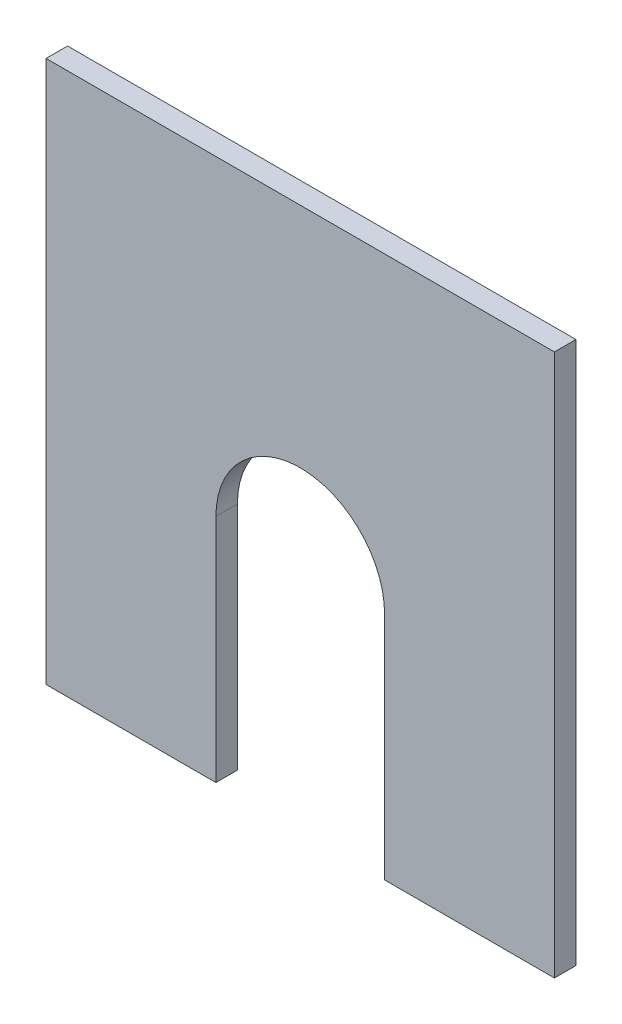
ISO-10303-21;
HEADER;
FILE_DESCRIPTION(('STEP AP214'),'2;1');
FILE_NAME('part.step','',(''),(''),'','','');
FILE_SCHEMA(('AUTOMOTIVE_DESIGN { 1 0 10303 214 1 1 1 1 }'));
ENDSEC;
DATA;
#1=APPLICATION_CONTEXT('core data for automotive mechanical design processes');
#2=APPLICATION_PROTOCOL_DEFINITION('international standard','automotive_design',2000,#1);
#3=PRODUCT_CONTEXT('',#1,'mechanical');
#4=PRODUCT('Part','Part','',(#3));
#5=PRODUCT_RELATED_PRODUCT_CATEGORY('part','',(#4));
#6=PRODUCT_DEFINITION_FORMATION('','',#4);
#7=PRODUCT_DEFINITION_CONTEXT('part definition',#1,'design');
#8=PRODUCT_DEFINITION('design','',#6,#7);
#9=PRODUCT_DEFINITION_SHAPE('','',#8);
#10=(LENGTH_UNIT() NAMED_UNIT(*) SI_UNIT(.MILLI.,.METRE.));
#11=(NAMED_UNIT(*) PLANE_ANGLE_UNIT() SI_UNIT($,.RADIAN.));
#12=(NAMED_UNIT(*) SI_UNIT($,.STERADIAN.) SOLID_ANGLE_UNIT());
#13=UNCERTAINTY_MEASURE_WITH_UNIT(LENGTH_MEASURE(1.E-05),#10,'distance_accuracy_value','');
#14=(GEOMETRIC_REPRESENTATION_CONTEXT(3) GLOBAL_UNCERTAINTY_ASSIGNED_CONTEXT((#13)) GLOBAL_UNIT_ASSIGNED_CONTEXT((#10,
#11,#12)) REPRESENTATION_CONTEXT('',''));
#15=CARTESIAN_POINT('',(0.,0.,0.));
#16=DIRECTION('',(0.,0.,1.));
#17=DIRECTION('',(1.,0.,0.));
#18=AXIS2_PLACEMENT_3D('',#15,#16,#17);
#19=CARTESIAN_POINT('',(-75.,-80.,6.35));
#20=DIRECTION('',(0.,1.,0.));
#21=DIRECTION('',(0.,0.,1.));
#22=AXIS2_PLACEMENT_3D('',#19,#20,#21);
#23=PLANE('',#22);
#24=DIRECTION('',(1.,0.,0.));
#25=VECTOR('',#24,1.);
#26=CARTESIAN_POINT('',(-75.,-80.,0.));
#27=LINE('',#26,#25);
#28=CARTESIAN_POINT('',(-75.,-80.,0.));
#29=VERTEX_POINT('',#28);
#30=CARTESIAN_POINT('',(-24.89,-80.,0.));
#31=VERTEX_POINT('',#30);
#32=EDGE_CURVE('E122',#29,#31,#27,.T.);
#33=ORIENTED_EDGE('',*,*,#32,.T.);
#34=DIRECTION('',(0.,0.,1.));
#35=VECTOR('',#34,1.);
#36=CARTESIAN_POINT('',(-24.89,-80.,-0.00100000000000013));
#37=LINE('',#36,#35);
#38=CARTESIAN_POINT('',(-24.89,-80.,6.35));
#39=VERTEX_POINT('',#38);
#40=EDGE_CURVE('E114',#31,#39,#37,.T.);
#41=ORIENTED_EDGE('',*,*,#40,.T.);
#42=DIRECTION('',(1.,0.,0.));
#43=VECTOR('',#42,1.);
#44=CARTESIAN_POINT('',(-75.,-80.,6.35));
#45=LINE('',#44,#43);
#46=CARTESIAN_POINT('',(-75.,-80.,6.35));
#47=VERTEX_POINT('',#46);
#48=EDGE_CURVE('E134',#47,#39,#45,.T.);
#49=ORIENTED_EDGE('',*,*,#48,.F.);
#50=DIRECTION('',(0.,0.,-1.));
#51=VECTOR('',#50,1.);
#52=CARTESIAN_POINT('',(-75.,-80.,6.35));
#53=LINE('',#52,#51);
#54=EDGE_CURVE('E133',#47,#29,#53,.T.);
#55=ORIENTED_EDGE('',*,*,#54,.T.);
#56=EDGE_LOOP('',(#33,#41,#49,#55));
#57=FACE_BOUND('',#56,.T.);
#58=ADVANCED_FACE('F33',(#57),#23,.F.);
#59=CARTESIAN_POINT('',(75.,80.,6.35));
#60=DIRECTION('',(-1.,0.,0.));
#61=DIRECTION('',(0.,0.,1.));
#62=AXIS2_PLACEMENT_3D('',#59,#60,#61);
#63=PLANE('',#62);
#64=DIRECTION('',(0.,1.,0.));
#65=VECTOR('',#64,1.);
#66=CARTESIAN_POINT('',(75.,80.,0.));
#67=LINE('',#66,#65);
#68=CARTESIAN_POINT('',(75.,-80.,0.));
#69=VERTEX_POINT('',#68);
#70=CARTESIAN_POINT('',(75.,80.,0.));
#71=VERTEX_POINT('',#70);
#72=EDGE_CURVE('E113',#69,#71,#67,.T.);
#73=ORIENTED_EDGE('',*,*,#72,.T.);
#74=DIRECTION('',(0.,0.,-1.));
#75=VECTOR('',#74,1.);
#76=CARTESIAN_POINT('',(75.,80.,6.35));
#77=LINE('',#76,#75);
#78=CARTESIAN_POINT('',(75.,80.,6.35));
#79=VERTEX_POINT('',#78);
#80=EDGE_CURVE('E11',#79,#71,#77,.T.);
#81=ORIENTED_EDGE('',*,*,#80,.F.);
#82=DIRECTION('',(0.,1.,0.));
#83=VECTOR('',#82,1.);
#84=CARTESIAN_POINT('',(75.,80.,6.35));
#85=LINE('',#84,#83);
#86=CARTESIAN_POINT('',(75.,-80.,6.35));
#87=VERTEX_POINT('',#86);
#88=EDGE_CURVE('E126',#87,#79,#85,.T.);
#89=ORIENTED_EDGE('',*,*,#88,.F.);
#90=DIRECTION('',(0.,0.,-1.));
#91=VECTOR('',#90,1.);
#92=CARTESIAN_POINT('',(75.,-80.,6.35));
#93=LINE('',#92,#91);
#94=EDGE_CURVE('E131',#87,#69,#93,.T.);
#95=ORIENTED_EDGE('',*,*,#94,.T.);
#96=EDGE_LOOP('',(#73,#81,#89,#95));
#97=FACE_BOUND('',#96,.T.);
#98=ADVANCED_FACE('F35',(#97),#63,.F.);
#99=CARTESIAN_POINT('',(-75.,80.,6.35));
#100=DIRECTION('',(0.,-1.,0.));
#101=DIRECTION('',(0.,0.,-1.));
#102=AXIS2_PLACEMENT_3D('',#99,#100,#101);
#103=PLANE('',#102);
#104=DIRECTION('',(-1.,0.,0.));
#105=VECTOR('',#104,1.);
#106=CARTESIAN_POINT('',(-75.,80.,0.));
#107=LINE('',#106,#105);
#108=CARTESIAN_POINT('',(-75.,80.,0.));
#109=VERTEX_POINT('',#108);
#110=EDGE_CURVE('E127',#71,#109,#107,.T.);
#111=ORIENTED_EDGE('',*,*,#110,.T.);
#112=DIRECTION('',(0.,0.,-1.));
#113=VECTOR('',#112,1.);
#114=CARTESIAN_POINT('',(-75.,80.,6.35));
#115=LINE('',#114,#113);
#116=CARTESIAN_POINT('',(-75.,80.,6.35));
#117=VERTEX_POINT('',#116);
#118=EDGE_CURVE('E41',#117,#109,#115,.T.);
#119=ORIENTED_EDGE('',*,*,#118,.F.);
#120=DIRECTION('',(-1.,0.,0.));
#121=VECTOR('',#120,1.);
#122=CARTESIAN_POINT('',(-75.,80.,6.35));
#123=LINE('',#122,#121);
#124=EDGE_CURVE('E86',#79,#117,#123,.T.);
#125=ORIENTED_EDGE('',*,*,#124,.F.);
#126=ORIENTED_EDGE('',*,*,#80,.T.);
#127=EDGE_LOOP('',(#111,#119,#125,#126));
#128=FACE_BOUND('',#127,.T.);
#129=ADVANCED_FACE('F156',(#128),#103,.F.);
#130=CARTESIAN_POINT('',(-75.,80.,6.35));
#131=DIRECTION('',(1.,0.,0.));
#132=DIRECTION('',(0.,1.,0.));
#133=AXIS2_PLACEMENT_3D('',#130,#131,#132);
#134=PLANE('',#133);
#135=DIRECTION('',(0.,-1.,0.));
#136=VECTOR('',#135,1.);
#137=CARTESIAN_POINT('',(-75.,80.,0.));
#138=LINE('',#137,#136);
#139=EDGE_CURVE('E123',#109,#29,#138,.T.);
#140=ORIENTED_EDGE('',*,*,#139,.T.);
#141=ORIENTED_EDGE('',*,*,#54,.F.);
#142=DIRECTION('',(0.,-1.,0.));
#143=VECTOR('',#142,1.);
#144=CARTESIAN_POINT('',(-75.,80.,6.35));
#145=LINE('',#144,#143);
#146=EDGE_CURVE('E142',#117,#47,#145,.T.);
#147=ORIENTED_EDGE('',*,*,#146,.F.);
#148=ORIENTED_EDGE('',*,*,#118,.T.);
#149=EDGE_LOOP('',(#140,#141,#147,#148));
#150=FACE_BOUND('',#149,.T.);
#151=ADVANCED_FACE('F140',(#150),#134,.F.);
#152=CARTESIAN_POINT('',(24.89,-80.,6.35));
#153=VERTEX_POINT('',#152);
#154=EDGE_CURVE('E57',#153,#87,#45,.T.);
#155=ORIENTED_EDGE('',*,*,#154,.F.);
#156=DIRECTION('',(0.,0.,1.));
#157=VECTOR('',#156,1.);
#158=CARTESIAN_POINT('',(24.89,-80.,-0.00100000000000013));
#159=LINE('',#158,#157);
#160=CARTESIAN_POINT('',(24.89,-80.,0.));
#161=VERTEX_POINT('',#160);
#162=EDGE_CURVE('E110',#161,#153,#159,.T.);
#163=ORIENTED_EDGE('',*,*,#162,.F.);
#164=EDGE_CURVE('E79',#161,#69,#27,.T.);
#165=ORIENTED_EDGE('',*,*,#164,.T.);
#166=ORIENTED_EDGE('',*,*,#94,.F.);
#167=EDGE_LOOP('',(#155,#163,#165,#166));
#168=FACE_BOUND('',#167,.T.);
#169=ADVANCED_FACE('F116',(#168),#23,.F.);
#170=CARTESIAN_POINT('',(0.,0.,6.35));
#171=DIRECTION('',(0.,0.,1.));
#172=DIRECTION('',(1.,0.,0.));
#173=AXIS2_PLACEMENT_3D('',#170,#171,#172);
#174=PLANE('',#173);
#175=DIRECTION('',(0.,-1.,0.));
#176=VECTOR('',#175,1.);
#177=CARTESIAN_POINT('',(-24.89,-12.,6.35));
#178=LINE('',#177,#176);
#179=CARTESIAN_POINT('',(-24.89,-12.,6.35));
#180=VERTEX_POINT('',#179);
#181=EDGE_CURVE('E117',#180,#39,#178,.T.);
#182=ORIENTED_EDGE('',*,*,#181,.F.);
#183=CARTESIAN_POINT('',(0.,-12.,6.35));
#184=DIRECTION('',(0.,0.,1.));
#185=DIRECTION('',(-1.,0.,0.));
#186=AXIS2_PLACEMENT_3D('',#183,#184,#185);
#187=CIRCLE('',#186,24.89);
#188=CARTESIAN_POINT('',(24.89,-12.,6.35));
#189=VERTEX_POINT('',#188);
#190=EDGE_CURVE('E167',#189,#180,#187,.T.);
#191=ORIENTED_EDGE('',*,*,#190,.F.);
#192=DIRECTION('',(0.,1.,0.));
#193=VECTOR('',#192,1.);
#194=CARTESIAN_POINT('',(24.89,-12.,6.35));
#195=LINE('',#194,#193);
#196=EDGE_CURVE('E170',#153,#189,#195,.T.);
#197=ORIENTED_EDGE('',*,*,#196,.F.);
#198=ORIENTED_EDGE('',*,*,#154,.T.);
#199=ORIENTED_EDGE('',*,*,#88,.T.);
#200=ORIENTED_EDGE('',*,*,#124,.T.);
#201=ORIENTED_EDGE('',*,*,#146,.T.);
#202=ORIENTED_EDGE('',*,*,#48,.T.);
#203=EDGE_LOOP('',(#182,#191,#197,#198,#199,#200,#201,#202));
#204=FACE_BOUND('',#203,.T.);
#205=ADVANCED_FACE('F176',(#204),#174,.T.);
#206=CARTESIAN_POINT('',(0.,0.,0.));
#207=DIRECTION('',(0.,0.,1.));
#208=DIRECTION('',(1.,0.,0.));
#209=AXIS2_PLACEMENT_3D('',#206,#207,#208);
#210=PLANE('',#209);
#211=CARTESIAN_POINT('',(0.,-12.,0.));
#212=DIRECTION('',(0.,0.,1.));
#213=DIRECTION('',(1.,0.,0.));
#214=AXIS2_PLACEMENT_3D('',#211,#212,#213);
#215=CIRCLE('',#214,24.89);
#216=CARTESIAN_POINT('',(-24.89,-12.,0.));
#217=VERTEX_POINT('',#216);
#218=CARTESIAN_POINT('',(24.89,-12.,0.));
#219=VERTEX_POINT('',#218);
#220=EDGE_CURVE('E48',#217,#219,#215,.F.);
#221=ORIENTED_EDGE('',*,*,#220,.F.);
#222=DIRECTION('',(0.,1.,0.));
#223=VECTOR('',#222,1.);
#224=CARTESIAN_POINT('',(-24.89,-12.,0.));
#225=LINE('',#224,#223);
#226=EDGE_CURVE('E146',#31,#217,#225,.T.);
#227=ORIENTED_EDGE('',*,*,#226,.F.);
#228=ORIENTED_EDGE('',*,*,#32,.F.);
#229=ORIENTED_EDGE('',*,*,#139,.F.);
#230=ORIENTED_EDGE('',*,*,#110,.F.);
#231=ORIENTED_EDGE('',*,*,#72,.F.);
#232=ORIENTED_EDGE('',*,*,#164,.F.);
#233=DIRECTION('',(0.,-1.,0.));
#234=VECTOR('',#233,1.);
#235=CARTESIAN_POINT('',(24.89,-12.,0.));
#236=LINE('',#235,#234);
#237=EDGE_CURVE('E107',#219,#161,#236,.T.);
#238=ORIENTED_EDGE('',*,*,#237,.F.);
#239=EDGE_LOOP('',(#221,#227,#228,#229,#230,#231,#232,#238));
#240=FACE_BOUND('',#239,.T.);
#241=ADVANCED_FACE('F120',(#240),#210,.F.);
#242=CARTESIAN_POINT('',(-24.89,-12.,-0.00100000000000013));
#243=DIRECTION('',(-1.,0.,0.));
#244=DIRECTION('',(0.,-1.,0.));
#245=AXIS2_PLACEMENT_3D('',#242,#243,#244);
#246=PLANE('',#245);
#247=ORIENTED_EDGE('',*,*,#226,.T.);
#248=DIRECTION('',(0.,0.,1.));
#249=VECTOR('',#248,1.);
#250=CARTESIAN_POINT('',(-24.89,-12.,-0.00100000000000013));
#251=LINE('',#250,#249);
#252=EDGE_CURVE('E163',#217,#180,#251,.T.);
#253=ORIENTED_EDGE('',*,*,#252,.T.);
#254=ORIENTED_EDGE('',*,*,#181,.T.);
#255=ORIENTED_EDGE('',*,*,#40,.F.);
#256=EDGE_LOOP('',(#247,#253,#254,#255));
#257=FACE_BOUND('',#256,.T.);
#258=ADVANCED_FACE('F174',(#257),#246,.F.);
#259=CARTESIAN_POINT('',(0.,-12.,-0.00100000000000013));
#260=DIRECTION('',(0.,0.,1.));
#261=DIRECTION('',(1.,0.,0.));
#262=AXIS2_PLACEMENT_3D('',#259,#260,#261);
#263=CYLINDRICAL_SURFACE('',#262,24.89);
#264=ORIENTED_EDGE('',*,*,#220,.T.);
#265=DIRECTION('',(0.,0.,1.));
#266=VECTOR('',#265,1.);
#267=CARTESIAN_POINT('',(24.89,-12.,-0.00100000000000013));
#268=LINE('',#267,#266);
#269=EDGE_CURVE('E111',#219,#189,#268,.T.);
#270=ORIENTED_EDGE('',*,*,#269,.T.);
#271=ORIENTED_EDGE('',*,*,#190,.T.);
#272=ORIENTED_EDGE('',*,*,#252,.F.);
#273=EDGE_LOOP('',(#264,#270,#271,#272));
#274=FACE_BOUND('',#273,.T.);
#275=ADVANCED_FACE('F177',(#274),#263,.F.);
#276=CARTESIAN_POINT('',(24.89,-12.,-0.00100000000000013));
#277=DIRECTION('',(1.,0.,0.));
#278=DIRECTION('',(0.,1.,0.));
#279=AXIS2_PLACEMENT_3D('',#276,#277,#278);
#280=PLANE('',#279);
#281=ORIENTED_EDGE('',*,*,#237,.T.);
#282=ORIENTED_EDGE('',*,*,#162,.T.);
#283=ORIENTED_EDGE('',*,*,#196,.T.);
#284=ORIENTED_EDGE('',*,*,#269,.F.);
#285=EDGE_LOOP('',(#281,#282,#283,#284));
#286=FACE_BOUND('',#285,.T.);
#287=ADVANCED_FACE('F108',(#286),#280,.F.);
#288=CLOSED_SHELL('',(#58,#98,#129,#151,#169,#205,#241,#258,#275,#287));
#289=MANIFOLD_SOLID_BREP('B2',#288);
#290=ADVANCED_BREP_SHAPE_REPRESENTATION('',(#18,#289),#14);
#291=SHAPE_DEFINITION_REPRESENTATION(#9,#290);
ENDSEC;
END-ISO-10303-21;
